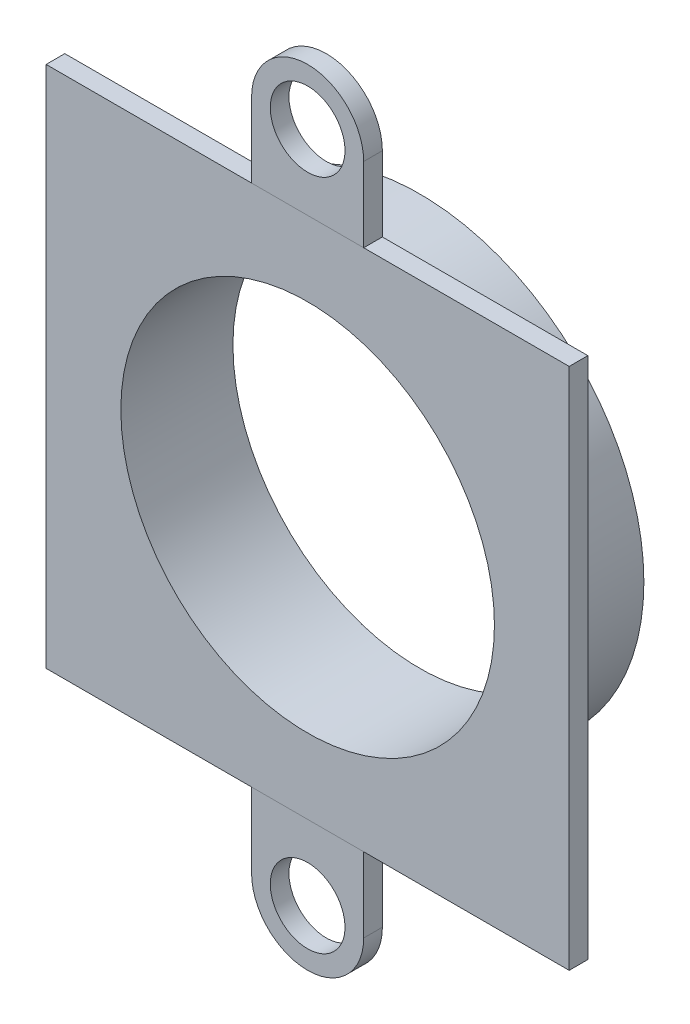
ISO-10303-21;
HEADER;
FILE_DESCRIPTION(('STEP AP214'),'2;1');
FILE_NAME('part.step','',(''),(''),'','','');
FILE_SCHEMA(('AUTOMOTIVE_DESIGN { 1 0 10303 214 1 1 1 1 }'));
ENDSEC;
DATA;
#1=APPLICATION_CONTEXT('core data for automotive mechanical design processes');
#2=APPLICATION_PROTOCOL_DEFINITION('international standard','automotive_design',2000,#1);
#3=PRODUCT_CONTEXT('',#1,'mechanical');
#4=PRODUCT('Part','Part','',(#3));
#5=PRODUCT_RELATED_PRODUCT_CATEGORY('part','',(#4));
#6=PRODUCT_DEFINITION_FORMATION('','',#4);
#7=PRODUCT_DEFINITION_CONTEXT('part definition',#1,'design');
#8=PRODUCT_DEFINITION('design','',#6,#7);
#9=PRODUCT_DEFINITION_SHAPE('','',#8);
#10=(LENGTH_UNIT() NAMED_UNIT(*) SI_UNIT(.MILLI.,.METRE.));
#11=(NAMED_UNIT(*) PLANE_ANGLE_UNIT() SI_UNIT($,.RADIAN.));
#12=(NAMED_UNIT(*) SI_UNIT($,.STERADIAN.) SOLID_ANGLE_UNIT());
#13=UNCERTAINTY_MEASURE_WITH_UNIT(LENGTH_MEASURE(1.E-05),#10,'distance_accuracy_value','');
#14=(GEOMETRIC_REPRESENTATION_CONTEXT(3) GLOBAL_UNCERTAINTY_ASSIGNED_CONTEXT((#13)) GLOBAL_UNIT_ASSIGNED_CONTEXT((#10,
#11,#12)) REPRESENTATION_CONTEXT('',''));
#15=CARTESIAN_POINT('',(0.,0.,0.));
#16=DIRECTION('',(0.,0.,1.));
#17=DIRECTION('',(1.,0.,0.));
#18=AXIS2_PLACEMENT_3D('',#15,#16,#17);
#19=CARTESIAN_POINT('',(-1.5,10.5,0.5));
#20=DIRECTION('',(0.,0.,-1.));
#21=DIRECTION('',(-1.,0.,0.));
#22=AXIS2_PLACEMENT_3D('',#19,#20,#21);
#23=PLANE('',#22);
#24=CARTESIAN_POINT('',(0.,9.,0.5));
#25=DIRECTION('',(0.,0.,1.));
#26=DIRECTION('',(-1.,0.,0.));
#27=AXIS2_PLACEMENT_3D('',#24,#25,#26);
#28=CIRCLE('',#27,1.);
#29=CARTESIAN_POINT('',(-1.,9.,0.5));
#30=VERTEX_POINT('',#29);
#31=EDGE_CURVE('E123',#30,#30,#28,.T.);
#32=ORIENTED_EDGE('',*,*,#31,.F.);
#33=EDGE_LOOP('',(#32));
#34=FACE_BOUND('',#33,.T.);
#35=CARTESIAN_POINT('',(0.,9.,0.5));
#36=DIRECTION('',(0.,0.,1.));
#37=DIRECTION('',(-1.,0.,0.));
#38=AXIS2_PLACEMENT_3D('',#35,#36,#37);
#39=CIRCLE('',#38,1.5);
#40=CARTESIAN_POINT('',(1.5,9.,0.5));
#41=VERTEX_POINT('',#40);
#42=CARTESIAN_POINT('',(-1.5,9.,0.5));
#43=VERTEX_POINT('',#42);
#44=EDGE_CURVE('E114',#41,#43,#39,.T.);
#45=ORIENTED_EDGE('',*,*,#44,.T.);
#46=DIRECTION('',(0.,-1.,0.));
#47=VECTOR('',#46,1.);
#48=CARTESIAN_POINT('',(-1.5,10.5,0.5));
#49=LINE('',#48,#47);
#50=CARTESIAN_POINT('',(-1.5,7.,0.5));
#51=VERTEX_POINT('',#50);
#52=EDGE_CURVE('E127',#43,#51,#49,.T.);
#53=ORIENTED_EDGE('',*,*,#52,.T.);
#54=DIRECTION('',(-1.,0.,0.));
#55=VECTOR('',#54,1.);
#56=CARTESIAN_POINT('',(-1.5,7.,0.5));
#57=LINE('',#56,#55);
#58=CARTESIAN_POINT('',(1.5,7.,0.5));
#59=VERTEX_POINT('',#58);
#60=EDGE_CURVE('E135',#59,#51,#57,.T.);
#61=ORIENTED_EDGE('',*,*,#60,.F.);
#62=DIRECTION('',(0.,-1.,0.));
#63=VECTOR('',#62,1.);
#64=CARTESIAN_POINT('',(1.5,10.5,0.5));
#65=LINE('',#64,#63);
#66=EDGE_CURVE('E76',#41,#59,#65,.T.);
#67=ORIENTED_EDGE('',*,*,#66,.F.);
#68=EDGE_LOOP('',(#45,#53,#61,#67));
#69=FACE_BOUND('',#68,.T.);
#70=ADVANCED_FACE('F68',(#34,#69),#23,.F.);
#71=CARTESIAN_POINT('',(-1.5,10.5,0.));
#72=DIRECTION('',(0.,0.,1.));
#73=DIRECTION('',(1.,0.,0.));
#74=AXIS2_PLACEMENT_3D('',#71,#72,#73);
#75=PLANE('',#74);
#76=CARTESIAN_POINT('',(0.,9.,0.));
#77=DIRECTION('',(0.,0.,1.));
#78=DIRECTION('',(-1.,0.,0.));
#79=AXIS2_PLACEMENT_3D('',#76,#77,#78);
#80=CIRCLE('',#79,1.);
#81=CARTESIAN_POINT('',(-1.,9.,0.));
#82=VERTEX_POINT('',#81);
#83=EDGE_CURVE('E144',#82,#82,#80,.T.);
#84=ORIENTED_EDGE('',*,*,#83,.T.);
#85=EDGE_LOOP('',(#84));
#86=FACE_BOUND('',#85,.T.);
#87=DIRECTION('',(0.,-1.,0.));
#88=VECTOR('',#87,1.);
#89=CARTESIAN_POINT('',(1.5,10.5,0.));
#90=LINE('',#89,#88);
#91=CARTESIAN_POINT('',(1.5,9.,0.));
#92=VERTEX_POINT('',#91);
#93=CARTESIAN_POINT('',(1.5,7.,0.));
#94=VERTEX_POINT('',#93);
#95=EDGE_CURVE('E120',#92,#94,#90,.T.);
#96=ORIENTED_EDGE('',*,*,#95,.T.);
#97=DIRECTION('',(1.,0.,0.));
#98=VECTOR('',#97,1.);
#99=CARTESIAN_POINT('',(-1.5,7.,0.));
#100=LINE('',#99,#98);
#101=CARTESIAN_POINT('',(-1.5,7.,0.));
#102=VERTEX_POINT('',#101);
#103=EDGE_CURVE('E125',#102,#94,#100,.T.);
#104=ORIENTED_EDGE('',*,*,#103,.F.);
#105=DIRECTION('',(0.,-1.,0.));
#106=VECTOR('',#105,1.);
#107=CARTESIAN_POINT('',(-1.5,10.5,0.));
#108=LINE('',#107,#106);
#109=CARTESIAN_POINT('',(-1.5,9.,0.));
#110=VERTEX_POINT('',#109);
#111=EDGE_CURVE('E121',#110,#102,#108,.T.);
#112=ORIENTED_EDGE('',*,*,#111,.F.);
#113=CARTESIAN_POINT('',(0.,9.,0.));
#114=DIRECTION('',(0.,0.,1.));
#115=DIRECTION('',(-1.,0.,0.));
#116=AXIS2_PLACEMENT_3D('',#113,#114,#115);
#117=CIRCLE('',#116,1.5);
#118=EDGE_CURVE('E111',#92,#110,#117,.T.);
#119=ORIENTED_EDGE('',*,*,#118,.F.);
#120=EDGE_LOOP('',(#96,#104,#112,#119));
#121=FACE_BOUND('',#120,.T.);
#122=ADVANCED_FACE('F118',(#86,#121),#75,.F.);
#123=CARTESIAN_POINT('',(-1.5,10.5,0.5));
#124=DIRECTION('',(1.,0.,0.));
#125=DIRECTION('',(0.,-1.,0.));
#126=AXIS2_PLACEMENT_3D('',#123,#124,#125);
#127=PLANE('',#126);
#128=DIRECTION('',(0.,0.,-1.));
#129=VECTOR('',#128,1.);
#130=CARTESIAN_POINT('',(-1.5,9.,4.));
#131=LINE('',#130,#129);
#132=EDGE_CURVE('E122',#43,#110,#131,.T.);
#133=ORIENTED_EDGE('',*,*,#132,.T.);
#134=ORIENTED_EDGE('',*,*,#111,.T.);
#135=DIRECTION('',(0.,0.,-1.));
#136=VECTOR('',#135,1.);
#137=CARTESIAN_POINT('',(-1.5,7.,0.5));
#138=LINE('',#137,#136);
#139=EDGE_CURVE('E90',#51,#102,#138,.T.);
#140=ORIENTED_EDGE('',*,*,#139,.F.);
#141=ORIENTED_EDGE('',*,*,#52,.F.);
#142=EDGE_LOOP('',(#133,#134,#140,#141));
#143=FACE_BOUND('',#142,.T.);
#144=ADVANCED_FACE('F159',(#143),#127,.F.);
#145=CARTESIAN_POINT('',(1.5,10.5,0.5));
#146=DIRECTION('',(-1.,0.,0.));
#147=DIRECTION('',(0.,1.,0.));
#148=AXIS2_PLACEMENT_3D('',#145,#146,#147);
#149=PLANE('',#148);
#150=ORIENTED_EDGE('',*,*,#66,.T.);
#151=DIRECTION('',(0.,0.,1.));
#152=VECTOR('',#151,1.);
#153=CARTESIAN_POINT('',(1.5,7.,0.5));
#154=LINE('',#153,#152);
#155=EDGE_CURVE('E83',#94,#59,#154,.T.);
#156=ORIENTED_EDGE('',*,*,#155,.F.);
#157=ORIENTED_EDGE('',*,*,#95,.F.);
#158=DIRECTION('',(0.,0.,-1.));
#159=VECTOR('',#158,1.);
#160=CARTESIAN_POINT('',(1.5,9.,4.));
#161=LINE('',#160,#159);
#162=EDGE_CURVE('E13',#41,#92,#161,.T.);
#163=ORIENTED_EDGE('',*,*,#162,.F.);
#164=EDGE_LOOP('',(#150,#156,#157,#163));
#165=FACE_BOUND('',#164,.T.);
#166=ADVANCED_FACE('F70',(#165),#149,.F.);
#167=CARTESIAN_POINT('',(0.,7.,0.));
#168=DIRECTION('',(0.,1.,0.));
#169=DIRECTION('',(0.,0.,-1.));
#170=AXIS2_PLACEMENT_3D('',#167,#168,#169);
#171=PLANE('',#170);
#172=ORIENTED_EDGE('',*,*,#155,.T.);
#173=ORIENTED_EDGE('',*,*,#60,.T.);
#174=ORIENTED_EDGE('',*,*,#139,.T.);
#175=ORIENTED_EDGE('',*,*,#103,.T.);
#176=EDGE_LOOP('',(#172,#173,#174,#175));
#177=FACE_BOUND('',#176,.T.);
#178=ADVANCED_FACE('F165',(#177),#171,.F.);
#179=CARTESIAN_POINT('',(0.,9.,4.));
#180=DIRECTION('',(0.,0.,-1.));
#181=DIRECTION('',(-1.,0.,0.));
#182=AXIS2_PLACEMENT_3D('',#179,#180,#181);
#183=CYLINDRICAL_SURFACE('',#182,1.5);
#184=ORIENTED_EDGE('',*,*,#44,.F.);
#185=ORIENTED_EDGE('',*,*,#162,.T.);
#186=ORIENTED_EDGE('',*,*,#118,.T.);
#187=ORIENTED_EDGE('',*,*,#132,.F.);
#188=EDGE_LOOP('',(#184,#185,#186,#187));
#189=FACE_BOUND('',#188,.T.);
#190=ADVANCED_FACE('F110',(#189),#183,.T.);
#191=CARTESIAN_POINT('',(0.,9.,4.));
#192=DIRECTION('',(0.,0.,-1.));
#193=DIRECTION('',(-1.,0.,0.));
#194=AXIS2_PLACEMENT_3D('',#191,#192,#193);
#195=CYLINDRICAL_SURFACE('',#194,1.);
#196=ORIENTED_EDGE('',*,*,#83,.F.);
#197=EDGE_LOOP('',(#196));
#198=FACE_BOUND('',#197,.T.);
#199=ORIENTED_EDGE('',*,*,#31,.T.);
#200=EDGE_LOOP('',(#199));
#201=FACE_BOUND('',#200,.T.);
#202=ADVANCED_FACE('F149',(#198,#201),#195,.F.);
#203=CLOSED_SHELL('',(#70,#122,#144,#166,#178,#190,#202));
#204=MANIFOLD_SOLID_BREP('B2',#203);
#205=CARTESIAN_POINT('',(-1.5,-10.5,0.5));
#206=DIRECTION('',(0.,0.,-1.));
#207=DIRECTION('',(-1.,0.,0.));
#208=AXIS2_PLACEMENT_3D('',#205,#206,#207);
#209=PLANE('',#208);
#210=CARTESIAN_POINT('',(0.,-9.,0.5));
#211=DIRECTION('',(0.,0.,-1.));
#212=DIRECTION('',(-1.,0.,0.));
#213=AXIS2_PLACEMENT_3D('',#210,#211,#212);
#214=CIRCLE('',#213,1.);
#215=CARTESIAN_POINT('',(-1.,-9.,0.5));
#216=VERTEX_POINT('',#215);
#217=EDGE_CURVE('E272',#216,#216,#214,.T.);
#218=ORIENTED_EDGE('',*,*,#217,.T.);
#219=EDGE_LOOP('',(#218));
#220=FACE_BOUND('',#219,.T.);
#221=CARTESIAN_POINT('',(0.,-9.,0.5));
#222=DIRECTION('',(0.,0.,-1.));
#223=DIRECTION('',(-1.,0.,0.));
#224=AXIS2_PLACEMENT_3D('',#221,#222,#223);
#225=CIRCLE('',#224,1.5);
#226=CARTESIAN_POINT('',(1.5,-9.,0.5));
#227=VERTEX_POINT('',#226);
#228=CARTESIAN_POINT('',(-1.5,-9.,0.5));
#229=VERTEX_POINT('',#228);
#230=EDGE_CURVE('E291',#227,#229,#225,.T.);
#231=ORIENTED_EDGE('',*,*,#230,.F.);
#232=DIRECTION('',(0.,1.,0.));
#233=VECTOR('',#232,1.);
#234=CARTESIAN_POINT('',(1.5,-10.5,0.5));
#235=LINE('',#234,#233);
#236=CARTESIAN_POINT('',(1.5,-7.,0.5));
#237=VERTEX_POINT('',#236);
#238=EDGE_CURVE('E233',#227,#237,#235,.T.);
#239=ORIENTED_EDGE('',*,*,#238,.T.);
#240=DIRECTION('',(-1.,0.,0.));
#241=VECTOR('',#240,1.);
#242=CARTESIAN_POINT('',(-1.5,-7.,0.5));
#243=LINE('',#242,#241);
#244=CARTESIAN_POINT('',(-1.5,-7.,0.5));
#245=VERTEX_POINT('',#244);
#246=EDGE_CURVE('E289',#237,#245,#243,.T.);
#247=ORIENTED_EDGE('',*,*,#246,.T.);
#248=DIRECTION('',(0.,1.,0.));
#249=VECTOR('',#248,1.);
#250=CARTESIAN_POINT('',(-1.5,-10.5,0.5));
#251=LINE('',#250,#249);
#252=EDGE_CURVE('E279',#229,#245,#251,.T.);
#253=ORIENTED_EDGE('',*,*,#252,.F.);
#254=EDGE_LOOP('',(#231,#239,#247,#253));
#255=FACE_BOUND('',#254,.T.);
#256=ADVANCED_FACE('F225',(#220,#255),#209,.F.);
#257=CARTESIAN_POINT('',(-1.5,-10.5,0.));
#258=DIRECTION('',(0.,0.,1.));
#259=DIRECTION('',(1.,0.,0.));
#260=AXIS2_PLACEMENT_3D('',#257,#258,#259);
#261=PLANE('',#260);
#262=CARTESIAN_POINT('',(0.,-9.,0.));
#263=DIRECTION('',(0.,0.,-1.));
#264=DIRECTION('',(-1.,0.,0.));
#265=AXIS2_PLACEMENT_3D('',#262,#263,#264);
#266=CIRCLE('',#265,1.);
#267=CARTESIAN_POINT('',(-1.,-9.,0.));
#268=VERTEX_POINT('',#267);
#269=EDGE_CURVE('E304',#268,#268,#266,.T.);
#270=ORIENTED_EDGE('',*,*,#269,.F.);
#271=EDGE_LOOP('',(#270));
#272=FACE_BOUND('',#271,.T.);
#273=DIRECTION('',(0.,1.,0.));
#274=VECTOR('',#273,1.);
#275=CARTESIAN_POINT('',(1.5,-10.5,0.));
#276=LINE('',#275,#274);
#277=CARTESIAN_POINT('',(1.5,-9.,0.));
#278=VERTEX_POINT('',#277);
#279=CARTESIAN_POINT('',(1.5,-7.,0.));
#280=VERTEX_POINT('',#279);
#281=EDGE_CURVE('E239',#278,#280,#276,.T.);
#282=ORIENTED_EDGE('',*,*,#281,.F.);
#283=CARTESIAN_POINT('',(0.,-9.,0.));
#284=DIRECTION('',(0.,0.,-1.));
#285=DIRECTION('',(-1.,0.,0.));
#286=AXIS2_PLACEMENT_3D('',#283,#284,#285);
#287=CIRCLE('',#286,1.5);
#288=CARTESIAN_POINT('',(-1.5,-9.,0.));
#289=VERTEX_POINT('',#288);
#290=EDGE_CURVE('E267',#278,#289,#287,.T.);
#291=ORIENTED_EDGE('',*,*,#290,.T.);
#292=DIRECTION('',(0.,1.,0.));
#293=VECTOR('',#292,1.);
#294=CARTESIAN_POINT('',(-1.5,-10.5,0.));
#295=LINE('',#294,#293);
#296=CARTESIAN_POINT('',(-1.5,-7.,0.));
#297=VERTEX_POINT('',#296);
#298=EDGE_CURVE('E246',#289,#297,#295,.T.);
#299=ORIENTED_EDGE('',*,*,#298,.T.);
#300=DIRECTION('',(1.,0.,0.));
#301=VECTOR('',#300,1.);
#302=CARTESIAN_POINT('',(-1.5,-7.,0.));
#303=LINE('',#302,#301);
#304=EDGE_CURVE('E276',#297,#280,#303,.T.);
#305=ORIENTED_EDGE('',*,*,#304,.T.);
#306=EDGE_LOOP('',(#282,#291,#299,#305));
#307=FACE_BOUND('',#306,.T.);
#308=ADVANCED_FACE('F274',(#272,#307),#261,.F.);
#309=CARTESIAN_POINT('',(-1.5,-10.5,0.5));
#310=DIRECTION('',(1.,0.,0.));
#311=DIRECTION('',(0.,1.,0.));
#312=AXIS2_PLACEMENT_3D('',#309,#310,#311);
#313=PLANE('',#312);
#314=DIRECTION('',(0.,0.,-1.));
#315=VECTOR('',#314,1.);
#316=CARTESIAN_POINT('',(-1.5,-9.,4.));
#317=LINE('',#316,#315);
#318=EDGE_CURVE('E271',#229,#289,#317,.T.);
#319=ORIENTED_EDGE('',*,*,#318,.F.);
#320=ORIENTED_EDGE('',*,*,#252,.T.);
#321=DIRECTION('',(0.,0.,-1.));
#322=VECTOR('',#321,1.);
#323=CARTESIAN_POINT('',(-1.5,-7.,0.5));
#324=LINE('',#323,#322);
#325=EDGE_CURVE('E281',#245,#297,#324,.T.);
#326=ORIENTED_EDGE('',*,*,#325,.T.);
#327=ORIENTED_EDGE('',*,*,#298,.F.);
#328=EDGE_LOOP('',(#319,#320,#326,#327));
#329=FACE_BOUND('',#328,.T.);
#330=ADVANCED_FACE('F300',(#329),#313,.F.);
#331=CARTESIAN_POINT('',(1.5,-10.5,0.5));
#332=DIRECTION('',(-1.,0.,0.));
#333=DIRECTION('',(0.,-1.,0.));
#334=AXIS2_PLACEMENT_3D('',#331,#332,#333);
#335=PLANE('',#334);
#336=ORIENTED_EDGE('',*,*,#238,.F.);
#337=DIRECTION('',(0.,0.,-1.));
#338=VECTOR('',#337,1.);
#339=CARTESIAN_POINT('',(1.5,-9.,4.));
#340=LINE('',#339,#338);
#341=EDGE_CURVE('E66',#227,#278,#340,.T.);
#342=ORIENTED_EDGE('',*,*,#341,.T.);
#343=ORIENTED_EDGE('',*,*,#281,.T.);
#344=DIRECTION('',(0.,0.,1.));
#345=VECTOR('',#344,1.);
#346=CARTESIAN_POINT('',(1.5,-7.,0.5));
#347=LINE('',#346,#345);
#348=EDGE_CURVE('E294',#280,#237,#347,.T.);
#349=ORIENTED_EDGE('',*,*,#348,.T.);
#350=EDGE_LOOP('',(#336,#342,#343,#349));
#351=FACE_BOUND('',#350,.T.);
#352=ADVANCED_FACE('F227',(#351),#335,.F.);
#353=CARTESIAN_POINT('',(0.,-7.,0.));
#354=DIRECTION('',(0.,-1.,0.));
#355=DIRECTION('',(0.,0.,-1.));
#356=AXIS2_PLACEMENT_3D('',#353,#354,#355);
#357=PLANE('',#356);
#358=ORIENTED_EDGE('',*,*,#348,.F.);
#359=ORIENTED_EDGE('',*,*,#304,.F.);
#360=ORIENTED_EDGE('',*,*,#325,.F.);
#361=ORIENTED_EDGE('',*,*,#246,.F.);
#362=EDGE_LOOP('',(#358,#359,#360,#361));
#363=FACE_BOUND('',#362,.T.);
#364=ADVANCED_FACE('F293',(#363),#357,.F.);
#365=CARTESIAN_POINT('',(0.,-9.,4.));
#366=DIRECTION('',(0.,0.,-1.));
#367=DIRECTION('',(-1.,0.,0.));
#368=AXIS2_PLACEMENT_3D('',#365,#366,#367);
#369=CYLINDRICAL_SURFACE('',#368,1.5);
#370=ORIENTED_EDGE('',*,*,#230,.T.);
#371=ORIENTED_EDGE('',*,*,#318,.T.);
#372=ORIENTED_EDGE('',*,*,#290,.F.);
#373=ORIENTED_EDGE('',*,*,#341,.F.);
#374=EDGE_LOOP('',(#370,#371,#372,#373));
#375=FACE_BOUND('',#374,.T.);
#376=ADVANCED_FACE('F268',(#375),#369,.T.);
#377=CARTESIAN_POINT('',(0.,-9.,4.));
#378=DIRECTION('',(0.,0.,-1.));
#379=DIRECTION('',(-1.,0.,0.));
#380=AXIS2_PLACEMENT_3D('',#377,#378,#379);
#381=CYLINDRICAL_SURFACE('',#380,1.);
#382=ORIENTED_EDGE('',*,*,#269,.T.);
#383=EDGE_LOOP('',(#382));
#384=FACE_BOUND('',#383,.T.);
#385=ORIENTED_EDGE('',*,*,#217,.F.);
#386=EDGE_LOOP('',(#385));
#387=FACE_BOUND('',#386,.T.);
#388=ADVANCED_FACE('F308',(#384,#387),#381,.F.);
#389=CLOSED_SHELL('',(#256,#308,#330,#352,#364,#376,#388));
#390=MANIFOLD_SOLID_BREP('B7',#389);
#391=CARTESIAN_POINT('',(0.,0.,0.5));
#392=DIRECTION('',(0.,0.,1.));
#393=DIRECTION('',(1.,0.,0.));
#394=AXIS2_PLACEMENT_3D('',#391,#392,#393);
#395=PLANE('',#394);
#396=DIRECTION('',(0.,-1.,0.));
#397=VECTOR('',#396,1.);
#398=CARTESIAN_POINT('',(-7.,-7.,0.5));
#399=LINE('',#398,#397);
#400=CARTESIAN_POINT('',(-7.,7.,0.5));
#401=VERTEX_POINT('',#400);
#402=CARTESIAN_POINT('',(-7.,-7.,0.5));
#403=VERTEX_POINT('',#402);
#404=EDGE_CURVE('E426',#401,#403,#399,.T.);
#405=ORIENTED_EDGE('',*,*,#404,.T.);
#406=DIRECTION('',(1.,0.,0.));
#407=VECTOR('',#406,1.);
#408=CARTESIAN_POINT('',(7.,-7.,0.5));
#409=LINE('',#408,#407);
#410=CARTESIAN_POINT('',(7.,-7.,0.5));
#411=VERTEX_POINT('',#410);
#412=EDGE_CURVE('E421',#403,#411,#409,.T.);
#413=ORIENTED_EDGE('',*,*,#412,.T.);
#414=DIRECTION('',(0.,1.,0.));
#415=VECTOR('',#414,1.);
#416=CARTESIAN_POINT('',(7.,-7.,0.5));
#417=LINE('',#416,#415);
#418=CARTESIAN_POINT('',(7.,7.,0.5));
#419=VERTEX_POINT('',#418);
#420=EDGE_CURVE('E424',#411,#419,#417,.T.);
#421=ORIENTED_EDGE('',*,*,#420,.T.);
#422=DIRECTION('',(-1.,0.,0.));
#423=VECTOR('',#422,1.);
#424=CARTESIAN_POINT('',(7.,7.,0.5));
#425=LINE('',#424,#423);
#426=EDGE_CURVE('E390',#419,#401,#425,.T.);
#427=ORIENTED_EDGE('',*,*,#426,.T.);
#428=EDGE_LOOP('',(#405,#413,#421,#427));
#429=FACE_BOUND('',#428,.T.);
#430=CARTESIAN_POINT('',(0.,0.,0.5));
#431=DIRECTION('',(0.,0.,1.));
#432=DIRECTION('',(1.,0.,0.));
#433=AXIS2_PLACEMENT_3D('',#430,#431,#432);
#434=CIRCLE('',#433,5.);
#435=CARTESIAN_POINT('',(5.,0.,0.5));
#436=VERTEX_POINT('',#435);
#437=EDGE_CURVE('E443',#436,#436,#434,.T.);
#438=ORIENTED_EDGE('',*,*,#437,.F.);
#439=EDGE_LOOP('',(#438));
#440=FACE_BOUND('',#439,.T.);
#441=ADVANCED_FACE('F373',(#429,#440),#395,.T.);
#442=CARTESIAN_POINT('',(0.,0.,0.));
#443=DIRECTION('',(0.,0.,1.));
#444=DIRECTION('',(1.,0.,0.));
#445=AXIS2_PLACEMENT_3D('',#442,#443,#444);
#446=PLANE('',#445);
#447=CARTESIAN_POINT('',(0.,0.,0.));
#448=DIRECTION('',(0.,0.,1.));
#449=DIRECTION('',(1.,0.,0.));
#450=AXIS2_PLACEMENT_3D('',#447,#448,#449);
#451=CIRCLE('',#450,6.);
#452=CARTESIAN_POINT('',(6.,0.,0.));
#453=VERTEX_POINT('',#452);
#454=EDGE_CURVE('E223',#453,#453,#451,.F.);
#455=ORIENTED_EDGE('',*,*,#454,.F.);
#456=EDGE_LOOP('',(#455));
#457=FACE_BOUND('',#456,.T.);
#458=DIRECTION('',(0.,-1.,0.));
#459=VECTOR('',#458,1.);
#460=CARTESIAN_POINT('',(-7.,-7.,0.));
#461=LINE('',#460,#459);
#462=CARTESIAN_POINT('',(-7.,7.,0.));
#463=VERTEX_POINT('',#462);
#464=CARTESIAN_POINT('',(-7.,-7.,0.));
#465=VERTEX_POINT('',#464);
#466=EDGE_CURVE('E440',#463,#465,#461,.T.);
#467=ORIENTED_EDGE('',*,*,#466,.F.);
#468=DIRECTION('',(-1.,0.,0.));
#469=VECTOR('',#468,1.);
#470=CARTESIAN_POINT('',(7.,7.,0.));
#471=LINE('',#470,#469);
#472=CARTESIAN_POINT('',(7.,7.,0.));
#473=VERTEX_POINT('',#472);
#474=EDGE_CURVE('E413',#473,#463,#471,.T.);
#475=ORIENTED_EDGE('',*,*,#474,.F.);
#476=DIRECTION('',(0.,1.,0.));
#477=VECTOR('',#476,1.);
#478=CARTESIAN_POINT('',(7.,-7.,0.));
#479=LINE('',#478,#477);
#480=CARTESIAN_POINT('',(7.,-7.,0.));
#481=VERTEX_POINT('',#480);
#482=EDGE_CURVE('E407',#481,#473,#479,.T.);
#483=ORIENTED_EDGE('',*,*,#482,.F.);
#484=DIRECTION('',(1.,0.,0.));
#485=VECTOR('',#484,1.);
#486=CARTESIAN_POINT('',(7.,-7.,0.));
#487=LINE('',#486,#485);
#488=EDGE_CURVE('E431',#465,#481,#487,.T.);
#489=ORIENTED_EDGE('',*,*,#488,.F.);
#490=EDGE_LOOP('',(#467,#475,#483,#489));
#491=FACE_BOUND('',#490,.T.);
#492=ADVANCED_FACE('F451',(#457,#491),#446,.F.);
#493=CARTESIAN_POINT('',(-7.,-7.,0.5));
#494=DIRECTION('',(1.,0.,0.));
#495=DIRECTION('',(0.,0.,-1.));
#496=AXIS2_PLACEMENT_3D('',#493,#494,#495);
#497=PLANE('',#496);
#498=ORIENTED_EDGE('',*,*,#466,.T.);
#499=DIRECTION('',(0.,0.,-1.));
#500=VECTOR('',#499,1.);
#501=CARTESIAN_POINT('',(-7.,-7.,0.5));
#502=LINE('',#501,#500);
#503=EDGE_CURVE('E382',#403,#465,#502,.T.);
#504=ORIENTED_EDGE('',*,*,#503,.F.);
#505=ORIENTED_EDGE('',*,*,#404,.F.);
#506=DIRECTION('',(0.,0.,-1.));
#507=VECTOR('',#506,1.);
#508=CARTESIAN_POINT('',(-7.,7.,0.5));
#509=LINE('',#508,#507);
#510=EDGE_CURVE('E436',#401,#463,#509,.T.);
#511=ORIENTED_EDGE('',*,*,#510,.T.);
#512=EDGE_LOOP('',(#498,#504,#505,#511));
#513=FACE_BOUND('',#512,.T.);
#514=ADVANCED_FACE('F375',(#513),#497,.F.);
#515=CARTESIAN_POINT('',(7.,-7.,0.5));
#516=DIRECTION('',(0.,1.,0.));
#517=DIRECTION('',(-1.,0.,0.));
#518=AXIS2_PLACEMENT_3D('',#515,#516,#517);
#519=PLANE('',#518);
#520=ORIENTED_EDGE('',*,*,#488,.T.);
#521=DIRECTION('',(0.,0.,-1.));
#522=VECTOR('',#521,1.);
#523=CARTESIAN_POINT('',(7.,-7.,0.5));
#524=LINE('',#523,#522);
#525=EDGE_CURVE('E429',#411,#481,#524,.T.);
#526=ORIENTED_EDGE('',*,*,#525,.F.);
#527=ORIENTED_EDGE('',*,*,#412,.F.);
#528=ORIENTED_EDGE('',*,*,#503,.T.);
#529=EDGE_LOOP('',(#520,#526,#527,#528));
#530=FACE_BOUND('',#529,.T.);
#531=ADVANCED_FACE('F430',(#530),#519,.F.);
#532=CARTESIAN_POINT('',(7.,-7.,0.5));
#533=DIRECTION('',(-1.,0.,0.));
#534=DIRECTION('',(0.,0.,1.));
#535=AXIS2_PLACEMENT_3D('',#532,#533,#534);
#536=PLANE('',#535);
#537=ORIENTED_EDGE('',*,*,#482,.T.);
#538=DIRECTION('',(0.,0.,-1.));
#539=VECTOR('',#538,1.);
#540=CARTESIAN_POINT('',(7.,7.,0.5));
#541=LINE('',#540,#539);
#542=EDGE_CURVE('E432',#419,#473,#541,.T.);
#543=ORIENTED_EDGE('',*,*,#542,.F.);
#544=ORIENTED_EDGE('',*,*,#420,.F.);
#545=ORIENTED_EDGE('',*,*,#525,.T.);
#546=EDGE_LOOP('',(#537,#543,#544,#545));
#547=FACE_BOUND('',#546,.T.);
#548=ADVANCED_FACE('F434',(#547),#536,.F.);
#549=CARTESIAN_POINT('',(7.,7.,0.5));
#550=DIRECTION('',(0.,-1.,0.));
#551=DIRECTION('',(1.,0.,0.));
#552=AXIS2_PLACEMENT_3D('',#549,#550,#551);
#553=PLANE('',#552);
#554=ORIENTED_EDGE('',*,*,#474,.T.);
#555=ORIENTED_EDGE('',*,*,#510,.F.);
#556=ORIENTED_EDGE('',*,*,#426,.F.);
#557=ORIENTED_EDGE('',*,*,#542,.T.);
#558=EDGE_LOOP('',(#554,#555,#556,#557));
#559=FACE_BOUND('',#558,.T.);
#560=ADVANCED_FACE('F463',(#559),#553,.F.);
#561=CARTESIAN_POINT('',(0.,0.,0.5));
#562=DIRECTION('',(0.,0.,-1.));
#563=DIRECTION('',(-1.,0.,0.));
#564=AXIS2_PLACEMENT_3D('',#561,#562,#563);
#565=CYLINDRICAL_SURFACE('',#564,5.);
#566=ORIENTED_EDGE('',*,*,#437,.T.);
#567=EDGE_LOOP('',(#566));
#568=FACE_BOUND('',#567,.T.);
#569=CARTESIAN_POINT('',(0.,0.,-2.5));
#570=DIRECTION('',(0.,0.,-1.));
#571=DIRECTION('',(-1.,0.,0.));
#572=AXIS2_PLACEMENT_3D('',#569,#570,#571);
#573=CIRCLE('',#572,5.);
#574=CARTESIAN_POINT('',(-5.,0.,-2.5));
#575=VERTEX_POINT('',#574);
#576=EDGE_CURVE('E537',#575,#575,#573,.F.);
#577=ORIENTED_EDGE('',*,*,#576,.F.);
#578=EDGE_LOOP('',(#577));
#579=FACE_BOUND('',#578,.T.);
#580=ADVANCED_FACE('F466',(#568,#579),#565,.F.);
#581=CARTESIAN_POINT('',(0.,0.,-2.5));
#582=DIRECTION('',(0.,0.,1.));
#583=DIRECTION('',(1.,0.,0.));
#584=AXIS2_PLACEMENT_3D('',#581,#582,#583);
#585=CYLINDRICAL_SURFACE('',#584,6.);
#586=CARTESIAN_POINT('',(0.,0.,-2.5));
#587=DIRECTION('',(0.,0.,-1.));
#588=DIRECTION('',(-1.,0.,0.));
#589=AXIS2_PLACEMENT_3D('',#586,#587,#588);
#590=CIRCLE('',#589,6.);
#591=CARTESIAN_POINT('',(-6.,0.,-2.5));
#592=VERTEX_POINT('',#591);
#593=EDGE_CURVE('E540',#592,#592,#590,.T.);
#594=ORIENTED_EDGE('',*,*,#593,.F.);
#595=EDGE_LOOP('',(#594));
#596=FACE_BOUND('',#595,.T.);
#597=ORIENTED_EDGE('',*,*,#454,.T.);
#598=EDGE_LOOP('',(#597));
#599=FACE_BOUND('',#598,.T.);
#600=ADVANCED_FACE('F487',(#596,#599),#585,.T.);
#601=CARTESIAN_POINT('',(0.,0.,-2.5));
#602=DIRECTION('',(0.,0.,-1.));
#603=DIRECTION('',(-1.,0.,0.));
#604=AXIS2_PLACEMENT_3D('',#601,#602,#603);
#605=PLANE('',#604);
#606=ORIENTED_EDGE('',*,*,#576,.T.);
#607=EDGE_LOOP('',(#606));
#608=FACE_BOUND('',#607,.T.);
#609=ORIENTED_EDGE('',*,*,#593,.T.);
#610=EDGE_LOOP('',(#609));
#611=FACE_BOUND('',#610,.T.);
#612=ADVANCED_FACE('F494',(#608,#611),#605,.T.);
#613=CLOSED_SHELL('',(#441,#492,#514,#531,#548,#560,#580,#600,#612));
#614=MANIFOLD_SOLID_BREP('B60',#613);
#615=ADVANCED_BREP_SHAPE_REPRESENTATION('',(#18,#204,#390,#614),#14);
#616=SHAPE_DEFINITION_REPRESENTATION(#9,#615);
ENDSEC;
END-ISO-10303-21;
